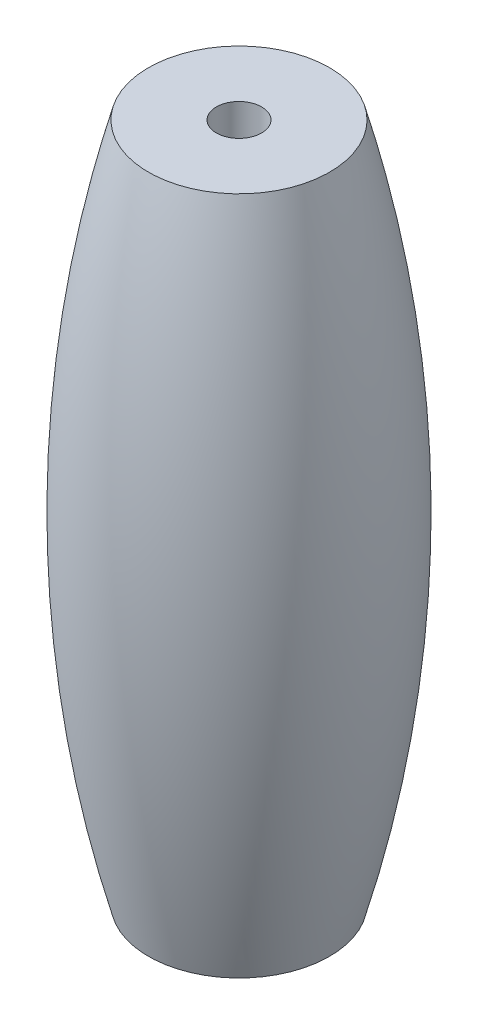
ISO-10303-21;
HEADER;
FILE_DESCRIPTION(('STEP AP214'),'2;1');
FILE_NAME('part.step','',(''),(''),'','','');
FILE_SCHEMA(('AUTOMOTIVE_DESIGN { 1 0 10303 214 1 1 1 1 }'));
ENDSEC;
DATA;
#1=APPLICATION_CONTEXT('core data for automotive mechanical design processes');
#2=APPLICATION_PROTOCOL_DEFINITION('international standard','automotive_design',2000,#1);
#3=PRODUCT_CONTEXT('',#1,'mechanical');
#4=PRODUCT('Part','Part','',(#3));
#5=PRODUCT_RELATED_PRODUCT_CATEGORY('part','',(#4));
#6=PRODUCT_DEFINITION_FORMATION('','',#4);
#7=PRODUCT_DEFINITION_CONTEXT('part definition',#1,'design');
#8=PRODUCT_DEFINITION('design','',#6,#7);
#9=PRODUCT_DEFINITION_SHAPE('','',#8);
#10=(LENGTH_UNIT() NAMED_UNIT(*) SI_UNIT(.MILLI.,.METRE.));
#11=(NAMED_UNIT(*) PLANE_ANGLE_UNIT() SI_UNIT($,.RADIAN.));
#12=(NAMED_UNIT(*) SI_UNIT($,.STERADIAN.) SOLID_ANGLE_UNIT());
#13=UNCERTAINTY_MEASURE_WITH_UNIT(LENGTH_MEASURE(1.E-05),#10,'distance_accuracy_value','');
#14=(GEOMETRIC_REPRESENTATION_CONTEXT(3) GLOBAL_UNCERTAINTY_ASSIGNED_CONTEXT((#13)) GLOBAL_UNIT_ASSIGNED_CONTEXT((#10,
#11,#12)) REPRESENTATION_CONTEXT('',''));
#15=CARTESIAN_POINT('',(0.,0.,0.));
#16=DIRECTION('',(0.,0.,1.));
#17=DIRECTION('',(1.,0.,0.));
#18=AXIS2_PLACEMENT_3D('',#15,#16,#17);
#19=CARTESIAN_POINT('',(0.,0.,0.));
#20=DIRECTION('',(0.,-1.,0.));
#21=DIRECTION('',(0.,0.,-1.));
#22=AXIS2_PLACEMENT_3D('',#19,#20,#21);
#23=PLANE('',#22);
#24=CARTESIAN_POINT('',(0.,0.,0.));
#25=DIRECTION('',(0.,1.,0.));
#26=DIRECTION('',(0.,0.,1.));
#27=AXIS2_PLACEMENT_3D('',#24,#25,#26);
#28=CIRCLE('',#27,1.);
#29=CARTESIAN_POINT('',(0.,0.,1.));
#30=VERTEX_POINT('',#29);
#31=EDGE_CURVE('E42',#30,#30,#28,.T.);
#32=ORIENTED_EDGE('',*,*,#31,.T.);
#33=EDGE_LOOP('',(#32));
#34=FACE_BOUND('',#33,.T.);
#35=CARTESIAN_POINT('',(0.,0.,0.));
#36=DIRECTION('',(0.,-1.,0.));
#37=DIRECTION('',(0.,0.,-1.));
#38=AXIS2_PLACEMENT_3D('',#35,#36,#37);
#39=CIRCLE('',#38,4.);
#40=CARTESIAN_POINT('',(0.,0.,-4.));
#41=VERTEX_POINT('',#40);
#42=EDGE_CURVE('E10',#41,#41,#39,.T.);
#43=ORIENTED_EDGE('',*,*,#42,.T.);
#44=EDGE_LOOP('',(#43));
#45=FACE_BOUND('',#44,.T.);
#46=ADVANCED_FACE('F32',(#34,#45),#23,.T.);
#47=CARTESIAN_POINT('',(0.,15.,0.));
#48=DIRECTION('',(0.,-1.,0.));
#49=DIRECTION('',(0.,0.,-1.));
#50=AXIS2_PLACEMENT_3D('',#47,#48,#49);
#51=DEGENERATE_TOROIDAL_SURFACE('',#50,51.25,57.25,.F.);
#52=CARTESIAN_POINT('',(0.,30.,0.));
#53=DIRECTION('',(0.,-1.,0.));
#54=DIRECTION('',(0.,0.,-1.));
#55=AXIS2_PLACEMENT_3D('',#52,#53,#54);
#56=CIRCLE('',#55,4.);
#57=CARTESIAN_POINT('',(0.,30.,-4.));
#58=VERTEX_POINT('',#57);
#59=EDGE_CURVE('E38',#58,#58,#56,.T.);
#60=ORIENTED_EDGE('',*,*,#59,.T.);
#61=EDGE_LOOP('',(#60));
#62=FACE_BOUND('',#61,.T.);
#63=ORIENTED_EDGE('',*,*,#42,.F.);
#64=EDGE_LOOP('',(#63));
#65=FACE_BOUND('',#64,.T.);
#66=ADVANCED_FACE('F57',(#62,#65),#51,.F.);
#67=CARTESIAN_POINT('',(0.,30.,0.));
#68=DIRECTION('',(0.,1.,0.));
#69=DIRECTION('',(0.,0.,1.));
#70=AXIS2_PLACEMENT_3D('',#67,#68,#69);
#71=PLANE('',#70);
#72=CARTESIAN_POINT('',(0.,30.,0.));
#73=DIRECTION('',(0.,1.,0.));
#74=DIRECTION('',(0.,0.,1.));
#75=AXIS2_PLACEMENT_3D('',#72,#73,#74);
#76=CIRCLE('',#75,1.);
#77=CARTESIAN_POINT('',(0.,30.,1.));
#78=VERTEX_POINT('',#77);
#79=EDGE_CURVE('E46',#78,#78,#76,.T.);
#80=ORIENTED_EDGE('',*,*,#79,.F.);
#81=EDGE_LOOP('',(#80));
#82=FACE_BOUND('',#81,.T.);
#83=ORIENTED_EDGE('',*,*,#59,.F.);
#84=EDGE_LOOP('',(#83));
#85=FACE_BOUND('',#84,.T.);
#86=ADVANCED_FACE('F54',(#82,#85),#71,.T.);
#87=CARTESIAN_POINT('',(0.,0.,0.));
#88=DIRECTION('',(0.,1.,0.));
#89=DIRECTION('',(0.,0.,1.));
#90=AXIS2_PLACEMENT_3D('',#87,#88,#89);
#91=CYLINDRICAL_SURFACE('',#90,1.);
#92=ORIENTED_EDGE('',*,*,#31,.F.);
#93=EDGE_LOOP('',(#92));
#94=FACE_BOUND('',#93,.T.);
#95=ORIENTED_EDGE('',*,*,#79,.T.);
#96=EDGE_LOOP('',(#95));
#97=FACE_BOUND('',#96,.T.);
#98=ADVANCED_FACE('F52',(#94,#97),#91,.F.);
#99=CLOSED_SHELL('',(#46,#66,#86,#98));
#100=MANIFOLD_SOLID_BREP('B2',#99);
#101=ADVANCED_BREP_SHAPE_REPRESENTATION('',(#18,#100),#14);
#102=SHAPE_DEFINITION_REPRESENTATION(#9,#101);
ENDSEC;
END-ISO-10303-21;
